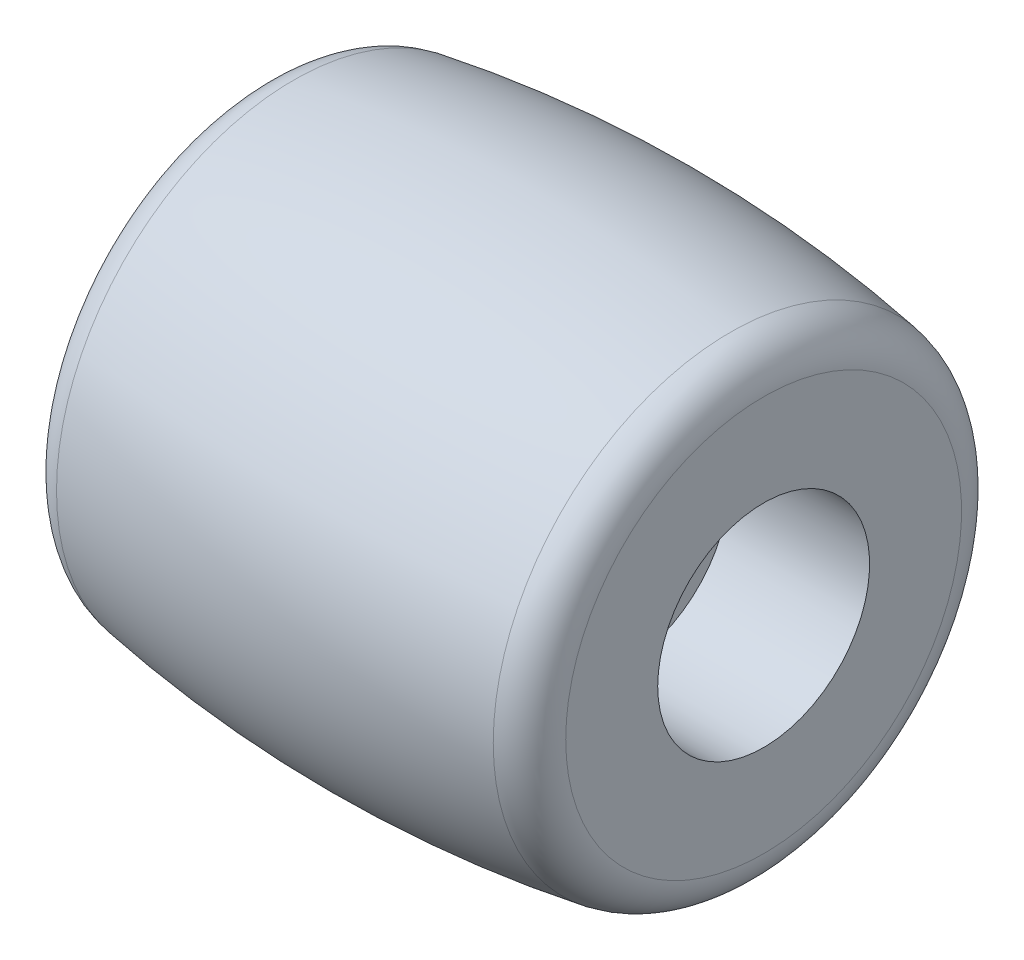
ISO-10303-21;
HEADER;
FILE_DESCRIPTION(('STEP AP214'),'2;1');
FILE_NAME('part.step','',(''),(''),'','','');
FILE_SCHEMA(('AUTOMOTIVE_DESIGN { 1 0 10303 214 1 1 1 1 }'));
ENDSEC;
DATA;
#1=APPLICATION_CONTEXT('core data for automotive mechanical design processes');
#2=APPLICATION_PROTOCOL_DEFINITION('international standard','automotive_design',2000,#1);
#3=PRODUCT_CONTEXT('',#1,'mechanical');
#4=PRODUCT('Part','Part','',(#3));
#5=PRODUCT_RELATED_PRODUCT_CATEGORY('part','',(#4));
#6=PRODUCT_DEFINITION_FORMATION('','',#4);
#7=PRODUCT_DEFINITION_CONTEXT('part definition',#1,'design');
#8=PRODUCT_DEFINITION('design','',#6,#7);
#9=PRODUCT_DEFINITION_SHAPE('','',#8);
#10=(LENGTH_UNIT() NAMED_UNIT(*) SI_UNIT(.MILLI.,.METRE.));
#11=(NAMED_UNIT(*) PLANE_ANGLE_UNIT() SI_UNIT($,.RADIAN.));
#12=(NAMED_UNIT(*) SI_UNIT($,.STERADIAN.) SOLID_ANGLE_UNIT());
#13=UNCERTAINTY_MEASURE_WITH_UNIT(LENGTH_MEASURE(1.E-05),#10,'distance_accuracy_value','');
#14=(GEOMETRIC_REPRESENTATION_CONTEXT(3) GLOBAL_UNCERTAINTY_ASSIGNED_CONTEXT((#13)) GLOBAL_UNIT_ASSIGNED_CONTEXT((#10,
#11,#12)) REPRESENTATION_CONTEXT('',''));
#15=CARTESIAN_POINT('',(0.,0.,0.));
#16=DIRECTION('',(0.,0.,1.));
#17=DIRECTION('',(1.,0.,0.));
#18=AXIS2_PLACEMENT_3D('',#15,#16,#17);
#19=CARTESIAN_POINT('',(-9.5,4.,0.));
#20=DIRECTION('',(1.,0.,0.));
#21=DIRECTION('',(0.,0.,-1.));
#22=AXIS2_PLACEMENT_3D('',#19,#20,#21);
#23=PLANE('',#22);
#24=CARTESIAN_POINT('',(-9.5,0.,0.));
#25=DIRECTION('',(1.,0.,0.));
#26=DIRECTION('',(0.,0.,-1.));
#27=AXIS2_PLACEMENT_3D('',#24,#25,#26);
#28=CIRCLE('',#27,7.47158261378696);
#29=CARTESIAN_POINT('',(-9.5,0.,-7.47158261378696));
#30=VERTEX_POINT('',#29);
#31=EDGE_CURVE('E10',#30,#30,#28,.F.);
#32=ORIENTED_EDGE('',*,*,#31,.T.);
#33=EDGE_LOOP('',(#32));
#34=FACE_BOUND('',#33,.T.);
#35=CARTESIAN_POINT('',(-9.5,0.,0.));
#36=DIRECTION('',(-1.,0.,0.));
#37=DIRECTION('',(0.,0.,1.));
#38=AXIS2_PLACEMENT_3D('',#35,#36,#37);
#39=CIRCLE('',#38,4.);
#40=CARTESIAN_POINT('',(-9.5,0.,4.));
#41=VERTEX_POINT('',#40);
#42=EDGE_CURVE('E66',#41,#41,#39,.T.);
#43=ORIENTED_EDGE('',*,*,#42,.F.);
#44=EDGE_LOOP('',(#43));
#45=FACE_BOUND('',#44,.T.);
#46=ADVANCED_FACE('F31',(#34,#45),#23,.F.);
#47=CARTESIAN_POINT('',(0.,0.,0.));
#48=DIRECTION('',(-1.,0.,0.));
#49=DIRECTION('',(0.,0.,1.));
#50=AXIS2_PLACEMENT_3D('',#47,#48,#49);
#51=DEGENERATE_TOROIDAL_SURFACE('',#50,41.175,50.8,.F.);
#52=CARTESIAN_POINT('',(8.24340770791075,0.,0.));
#53=DIRECTION('',(-1.,0.,0.));
#54=DIRECTION('',(0.,0.,1.));
#55=AXIS2_PLACEMENT_3D('',#52,#53,#54);
#56=CIRCLE('',#55,8.95170176025107);
#57=CARTESIAN_POINT('',(8.24340770791075,0.,8.95170176025107));
#58=VERTEX_POINT('',#57);
#59=EDGE_CURVE('E42',#58,#58,#56,.T.);
#60=ORIENTED_EDGE('',*,*,#59,.T.);
#61=EDGE_LOOP('',(#60));
#62=FACE_BOUND('',#61,.T.);
#63=CARTESIAN_POINT('',(-8.24340770791075,0.,0.));
#64=DIRECTION('',(1.,0.,0.));
#65=DIRECTION('',(0.,0.,-1.));
#66=AXIS2_PLACEMENT_3D('',#63,#64,#65);
#67=CIRCLE('',#66,8.95170176025107);
#68=CARTESIAN_POINT('',(-8.24340770791075,0.,-8.95170176025107));
#69=VERTEX_POINT('',#68);
#70=EDGE_CURVE('E46',#69,#69,#67,.T.);
#71=ORIENTED_EDGE('',*,*,#70,.T.);
#72=EDGE_LOOP('',(#71));
#73=FACE_BOUND('',#72,.T.);
#74=ADVANCED_FACE('F73',(#62,#73),#51,.F.);
#75=CARTESIAN_POINT('',(9.5,4.,0.));
#76=DIRECTION('',(-1.,0.,0.));
#77=DIRECTION('',(0.,0.,1.));
#78=AXIS2_PLACEMENT_3D('',#75,#76,#77);
#79=PLANE('',#78);
#80=CARTESIAN_POINT('',(9.5,0.,0.));
#81=DIRECTION('',(-1.,0.,0.));
#82=DIRECTION('',(0.,0.,1.));
#83=AXIS2_PLACEMENT_3D('',#80,#81,#82);
#84=CIRCLE('',#83,7.47158261378696);
#85=CARTESIAN_POINT('',(9.5,0.,7.47158261378696));
#86=VERTEX_POINT('',#85);
#87=EDGE_CURVE('E38',#86,#86,#84,.F.);
#88=ORIENTED_EDGE('',*,*,#87,.T.);
#89=EDGE_LOOP('',(#88));
#90=FACE_BOUND('',#89,.T.);
#91=CARTESIAN_POINT('',(9.5,0.,0.));
#92=DIRECTION('',(-1.,0.,0.));
#93=DIRECTION('',(0.,0.,1.));
#94=AXIS2_PLACEMENT_3D('',#91,#92,#93);
#95=CIRCLE('',#94,4.);
#96=CARTESIAN_POINT('',(9.5,0.,4.));
#97=VERTEX_POINT('',#96);
#98=EDGE_CURVE('E51',#97,#97,#95,.T.);
#99=ORIENTED_EDGE('',*,*,#98,.T.);
#100=EDGE_LOOP('',(#99));
#101=FACE_BOUND('',#100,.T.);
#102=ADVANCED_FACE('F78',(#90,#101),#79,.F.);
#103=CARTESIAN_POINT('',(0.,0.,0.));
#104=DIRECTION('',(-1.,0.,0.));
#105=DIRECTION('',(0.,0.,1.));
#106=AXIS2_PLACEMENT_3D('',#103,#104,#105);
#107=CYLINDRICAL_SURFACE('',#106,4.);
#108=ORIENTED_EDGE('',*,*,#98,.F.);
#109=EDGE_LOOP('',(#108));
#110=FACE_BOUND('',#109,.T.);
#111=CARTESIAN_POINT('',(4.2,0.,0.));
#112=DIRECTION('',(-1.,0.,0.));
#113=DIRECTION('',(0.,0.,1.));
#114=AXIS2_PLACEMENT_3D('',#111,#112,#113);
#115=CIRCLE('',#114,4.);
#116=CARTESIAN_POINT('',(4.2,0.,4.));
#117=VERTEX_POINT('',#116);
#118=EDGE_CURVE('E54',#117,#117,#115,.T.);
#119=ORIENTED_EDGE('',*,*,#118,.T.);
#120=EDGE_LOOP('',(#119));
#121=FACE_BOUND('',#120,.T.);
#122=ADVANCED_FACE('F112',(#110,#121),#107,.F.);
#123=CARTESIAN_POINT('',(4.2,2.5,0.));
#124=DIRECTION('',(-1.,0.,0.));
#125=DIRECTION('',(0.,0.,1.));
#126=AXIS2_PLACEMENT_3D('',#123,#124,#125);
#127=PLANE('',#126);
#128=ORIENTED_EDGE('',*,*,#118,.F.);
#129=EDGE_LOOP('',(#128));
#130=FACE_BOUND('',#129,.T.);
#131=CARTESIAN_POINT('',(4.2,0.,0.));
#132=DIRECTION('',(-1.,0.,0.));
#133=DIRECTION('',(0.,0.,1.));
#134=AXIS2_PLACEMENT_3D('',#131,#132,#133);
#135=CIRCLE('',#134,2.5);
#136=CARTESIAN_POINT('',(4.2,0.,2.5));
#137=VERTEX_POINT('',#136);
#138=EDGE_CURVE('E57',#137,#137,#135,.T.);
#139=ORIENTED_EDGE('',*,*,#138,.T.);
#140=EDGE_LOOP('',(#139));
#141=FACE_BOUND('',#140,.T.);
#142=ADVANCED_FACE('F108',(#130,#141),#127,.F.);
#143=CARTESIAN_POINT('',(0.,0.,0.));
#144=DIRECTION('',(-1.,0.,0.));
#145=DIRECTION('',(0.,0.,1.));
#146=AXIS2_PLACEMENT_3D('',#143,#144,#145);
#147=CYLINDRICAL_SURFACE('',#146,2.5);
#148=ORIENTED_EDGE('',*,*,#138,.F.);
#149=EDGE_LOOP('',(#148));
#150=FACE_BOUND('',#149,.T.);
#151=CARTESIAN_POINT('',(-4.2,0.,0.));
#152=DIRECTION('',(-1.,0.,0.));
#153=DIRECTION('',(0.,0.,1.));
#154=AXIS2_PLACEMENT_3D('',#151,#152,#153);
#155=CIRCLE('',#154,2.5);
#156=CARTESIAN_POINT('',(-4.2,0.,2.5));
#157=VERTEX_POINT('',#156);
#158=EDGE_CURVE('E60',#157,#157,#155,.T.);
#159=ORIENTED_EDGE('',*,*,#158,.T.);
#160=EDGE_LOOP('',(#159));
#161=FACE_BOUND('',#160,.T.);
#162=ADVANCED_FACE('F101',(#150,#161),#147,.F.);
#163=CARTESIAN_POINT('',(-4.2,2.5,0.));
#164=DIRECTION('',(1.,0.,0.));
#165=DIRECTION('',(0.,0.,-1.));
#166=AXIS2_PLACEMENT_3D('',#163,#164,#165);
#167=PLANE('',#166);
#168=ORIENTED_EDGE('',*,*,#158,.F.);
#169=EDGE_LOOP('',(#168));
#170=FACE_BOUND('',#169,.T.);
#171=CARTESIAN_POINT('',(-4.2,0.,0.));
#172=DIRECTION('',(-1.,0.,0.));
#173=DIRECTION('',(0.,0.,1.));
#174=AXIS2_PLACEMENT_3D('',#171,#172,#173);
#175=CIRCLE('',#174,4.);
#176=CARTESIAN_POINT('',(-4.2,0.,4.));
#177=VERTEX_POINT('',#176);
#178=EDGE_CURVE('E63',#177,#177,#175,.T.);
#179=ORIENTED_EDGE('',*,*,#178,.T.);
#180=EDGE_LOOP('',(#179));
#181=FACE_BOUND('',#180,.T.);
#182=ADVANCED_FACE('F90',(#170,#181),#167,.F.);
#183=CARTESIAN_POINT('',(0.,0.,0.));
#184=DIRECTION('',(-1.,0.,0.));
#185=DIRECTION('',(0.,0.,1.));
#186=AXIS2_PLACEMENT_3D('',#183,#184,#185);
#187=CYLINDRICAL_SURFACE('',#186,4.);
#188=ORIENTED_EDGE('',*,*,#178,.F.);
#189=EDGE_LOOP('',(#188));
#190=FACE_BOUND('',#189,.T.);
#191=ORIENTED_EDGE('',*,*,#42,.T.);
#192=EDGE_LOOP('',(#191));
#193=FACE_BOUND('',#192,.T.);
#194=ADVANCED_FACE('F70',(#190,#193),#187,.F.);
#195=CARTESIAN_POINT('',(8.,0.,0.));
#196=DIRECTION('',(-1.,0.,0.));
#197=DIRECTION('',(0.,0.,1.));
#198=AXIS2_PLACEMENT_3D('',#195,#196,#197);
#199=TOROIDAL_SURFACE('',#198,7.47158261378696,1.5);
#200=ORIENTED_EDGE('',*,*,#87,.F.);
#201=EDGE_LOOP('',(#200));
#202=FACE_BOUND('',#201,.T.);
#203=ORIENTED_EDGE('',*,*,#59,.F.);
#204=EDGE_LOOP('',(#203));
#205=FACE_BOUND('',#204,.T.);
#206=ADVANCED_FACE('F82',(#202,#205),#199,.T.);
#207=CARTESIAN_POINT('',(-8.,0.,0.));
#208=DIRECTION('',(1.,0.,0.));
#209=DIRECTION('',(0.,0.,-1.));
#210=AXIS2_PLACEMENT_3D('',#207,#208,#209);
#211=TOROIDAL_SURFACE('',#210,7.47158261378696,1.5);
#212=ORIENTED_EDGE('',*,*,#70,.F.);
#213=EDGE_LOOP('',(#212));
#214=FACE_BOUND('',#213,.T.);
#215=ORIENTED_EDGE('',*,*,#31,.F.);
#216=EDGE_LOOP('',(#215));
#217=FACE_BOUND('',#216,.T.);
#218=ADVANCED_FACE('F33',(#214,#217),#211,.T.);
#219=CLOSED_SHELL('',(#46,#74,#102,#122,#142,#162,#182,#194,#206,#218));
#220=MANIFOLD_SOLID_BREP('B2',#219);
#221=ADVANCED_BREP_SHAPE_REPRESENTATION('',(#18,#220),#14);
#222=SHAPE_DEFINITION_REPRESENTATION(#9,#221);
ENDSEC;
END-ISO-10303-21;
